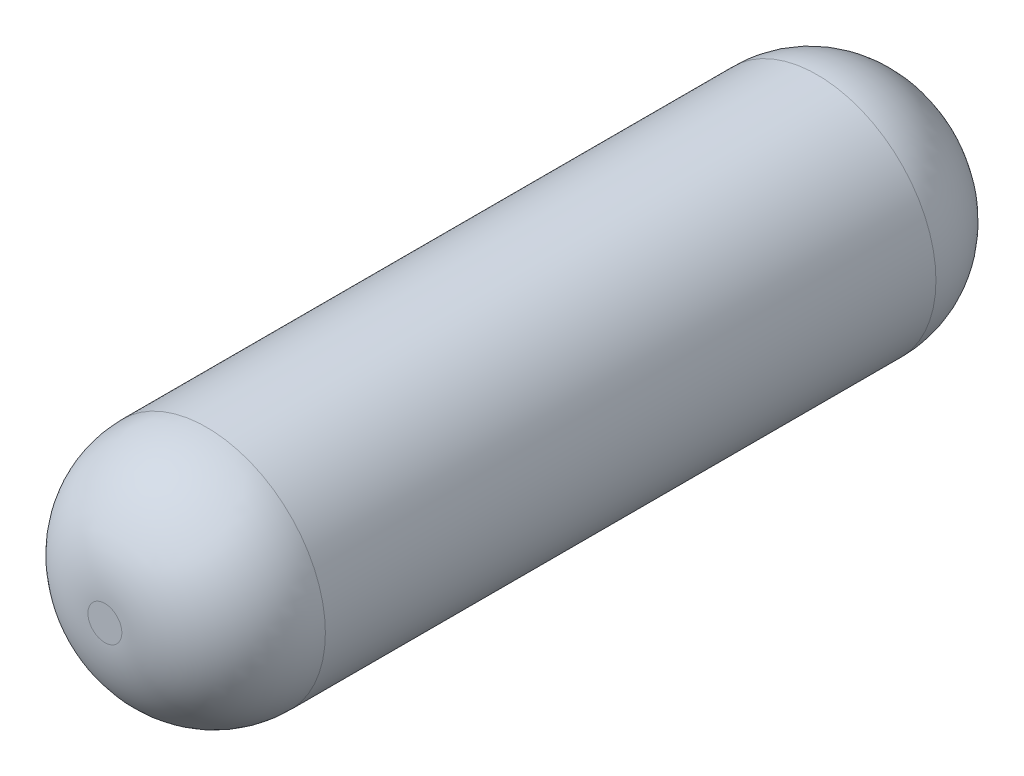
ISO-10303-21;
HEADER;
FILE_DESCRIPTION(('STEP AP214'),'2;1');
FILE_NAME('part.step','',(''),(''),'','','');
FILE_SCHEMA(('AUTOMOTIVE_DESIGN { 1 0 10303 214 1 1 1 1 }'));
ENDSEC;
DATA;
#1=APPLICATION_CONTEXT('core data for automotive mechanical design processes');
#2=APPLICATION_PROTOCOL_DEFINITION('international standard','automotive_design',2000,#1);
#3=PRODUCT_CONTEXT('',#1,'mechanical');
#4=PRODUCT('Part','Part','',(#3));
#5=PRODUCT_RELATED_PRODUCT_CATEGORY('part','',(#4));
#6=PRODUCT_DEFINITION_FORMATION('','',#4);
#7=PRODUCT_DEFINITION_CONTEXT('part definition',#1,'design');
#8=PRODUCT_DEFINITION('design','',#6,#7);
#9=PRODUCT_DEFINITION_SHAPE('','',#8);
#10=(LENGTH_UNIT() NAMED_UNIT(*) SI_UNIT(.MILLI.,.METRE.));
#11=(NAMED_UNIT(*) PLANE_ANGLE_UNIT() SI_UNIT($,.RADIAN.));
#12=(NAMED_UNIT(*) SI_UNIT($,.STERADIAN.) SOLID_ANGLE_UNIT());
#13=UNCERTAINTY_MEASURE_WITH_UNIT(LENGTH_MEASURE(1.E-05),#10,'distance_accuracy_value','');
#14=(GEOMETRIC_REPRESENTATION_CONTEXT(3) GLOBAL_UNCERTAINTY_ASSIGNED_CONTEXT((#13)) GLOBAL_UNIT_ASSIGNED_CONTEXT((#10,
#11,#12)) REPRESENTATION_CONTEXT('',''));
#15=CARTESIAN_POINT('',(0.,0.,0.));
#16=DIRECTION('',(0.,0.,1.));
#17=DIRECTION('',(1.,0.,0.));
#18=AXIS2_PLACEMENT_3D('',#15,#16,#17);
#19=CARTESIAN_POINT('',(0.,0.,240.));
#20=DIRECTION('',(0.,0.,-1.));
#21=DIRECTION('',(-1.,0.,0.));
#22=AXIS2_PLACEMENT_3D('',#19,#20,#21);
#23=CYLINDRICAL_SURFACE('',#22,35.);
#24=CARTESIAN_POINT('',(0.,0.,30.));
#25=DIRECTION('',(0.,0.,1.));
#26=DIRECTION('',(1.,0.,0.));
#27=AXIS2_PLACEMENT_3D('',#24,#25,#26);
#28=CIRCLE('',#27,35.);
#29=CARTESIAN_POINT('',(35.,0.,30.));
#30=VERTEX_POINT('',#29);
#31=EDGE_CURVE('E50',#30,#30,#28,.T.);
#32=ORIENTED_EDGE('',*,*,#31,.T.);
#33=EDGE_LOOP('',(#32));
#34=FACE_BOUND('',#33,.T.);
#35=CARTESIAN_POINT('',(0.,0.,210.));
#36=DIRECTION('',(0.,0.,1.));
#37=DIRECTION('',(1.,0.,0.));
#38=AXIS2_PLACEMENT_3D('',#35,#36,#37);
#39=CIRCLE('',#38,35.);
#40=CARTESIAN_POINT('',(35.,0.,210.));
#41=VERTEX_POINT('',#40);
#42=EDGE_CURVE('E54',#41,#41,#39,.F.);
#43=ORIENTED_EDGE('',*,*,#42,.T.);
#44=EDGE_LOOP('',(#43));
#45=FACE_BOUND('',#44,.T.);
#46=ADVANCED_FACE('F39',(#34,#45),#23,.T.);
#47=CARTESIAN_POINT('',(0.,0.,240.));
#48=DIRECTION('',(0.,0.,1.));
#49=DIRECTION('',(1.,0.,0.));
#50=AXIS2_PLACEMENT_3D('',#47,#48,#49);
#51=PLANE('',#50);
#52=CARTESIAN_POINT('',(0.,0.,240.));
#53=DIRECTION('',(0.,0.,1.));
#54=DIRECTION('',(1.,0.,0.));
#55=AXIS2_PLACEMENT_3D('',#52,#53,#54);
#56=CIRCLE('',#55,5.00000000000001);
#57=CARTESIAN_POINT('',(5.00000000000001,0.,240.));
#58=VERTEX_POINT('',#57);
#59=EDGE_CURVE('E10',#58,#58,#56,.T.);
#60=ORIENTED_EDGE('',*,*,#59,.T.);
#61=EDGE_LOOP('',(#60));
#62=FACE_BOUND('',#61,.T.);
#63=ADVANCED_FACE('F70',(#62),#51,.T.);
#64=CARTESIAN_POINT('',(0.,0.,0.));
#65=DIRECTION('',(0.,0.,1.));
#66=DIRECTION('',(1.,0.,0.));
#67=AXIS2_PLACEMENT_3D('',#64,#65,#66);
#68=PLANE('',#67);
#69=CARTESIAN_POINT('',(0.,0.,0.));
#70=DIRECTION('',(0.,0.,1.));
#71=DIRECTION('',(1.,0.,0.));
#72=AXIS2_PLACEMENT_3D('',#69,#70,#71);
#73=CIRCLE('',#72,5.00000000000001);
#74=CARTESIAN_POINT('',(5.00000000000001,0.,0.));
#75=VERTEX_POINT('',#74);
#76=EDGE_CURVE('E46',#75,#75,#73,.F.);
#77=ORIENTED_EDGE('',*,*,#76,.T.);
#78=EDGE_LOOP('',(#77));
#79=FACE_BOUND('',#78,.T.);
#80=ADVANCED_FACE('F67',(#79),#68,.F.);
#81=CARTESIAN_POINT('',(0.,0.,30.));
#82=DIRECTION('',(0.,0.,1.));
#83=DIRECTION('',(1.,0.,0.));
#84=AXIS2_PLACEMENT_3D('',#81,#82,#83);
#85=DEGENERATE_TOROIDAL_SURFACE('',#84,5.00000000000001,30.,.T.);
#86=ORIENTED_EDGE('',*,*,#76,.F.);
#87=EDGE_LOOP('',(#86));
#88=FACE_BOUND('',#87,.T.);
#89=ORIENTED_EDGE('',*,*,#31,.F.);
#90=EDGE_LOOP('',(#89));
#91=FACE_BOUND('',#90,.T.);
#92=ADVANCED_FACE('F63',(#88,#91),#85,.T.);
#93=CARTESIAN_POINT('',(0.,0.,210.));
#94=DIRECTION('',(0.,0.,1.));
#95=DIRECTION('',(1.,0.,0.));
#96=AXIS2_PLACEMENT_3D('',#93,#94,#95);
#97=DEGENERATE_TOROIDAL_SURFACE('',#96,5.00000000000001,30.,.T.);
#98=ORIENTED_EDGE('',*,*,#42,.F.);
#99=EDGE_LOOP('',(#98));
#100=FACE_BOUND('',#99,.T.);
#101=ORIENTED_EDGE('',*,*,#59,.F.);
#102=EDGE_LOOP('',(#101));
#103=FACE_BOUND('',#102,.T.);
#104=ADVANCED_FACE('F41',(#100,#103),#97,.T.);
#105=CLOSED_SHELL('',(#46,#63,#80,#92,#104));
#106=MANIFOLD_SOLID_BREP('B2',#105);
#107=ADVANCED_BREP_SHAPE_REPRESENTATION('',(#18,#106),#14);
#108=SHAPE_DEFINITION_REPRESENTATION(#9,#107);
ENDSEC;
END-ISO-10303-21;
